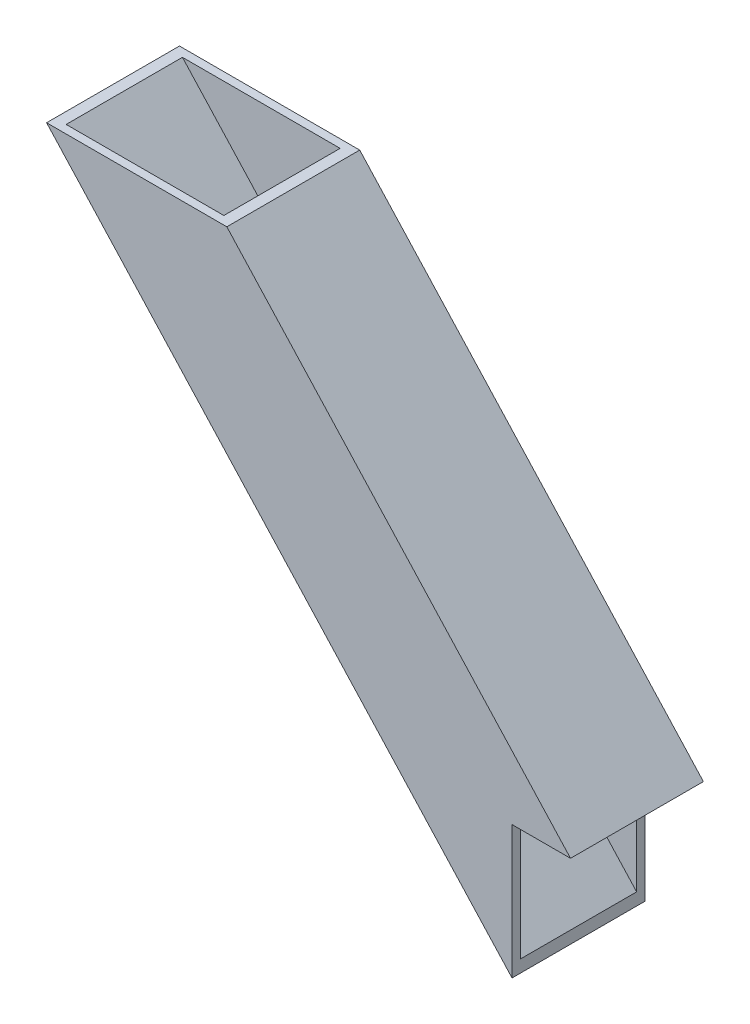
ISO-10303-21;
HEADER;
FILE_DESCRIPTION(('STEP AP214'),'2;1');
FILE_NAME('part.step','',(''),(''),'','','');
FILE_SCHEMA(('AUTOMOTIVE_DESIGN { 1 0 10303 214 1 1 1 1 }'));
ENDSEC;
DATA;
#1=APPLICATION_CONTEXT('core data for automotive mechanical design processes');
#2=APPLICATION_PROTOCOL_DEFINITION('international standard','automotive_design',2000,#1);
#3=PRODUCT_CONTEXT('',#1,'mechanical');
#4=PRODUCT('Part','Part','',(#3));
#5=PRODUCT_RELATED_PRODUCT_CATEGORY('part','',(#4));
#6=PRODUCT_DEFINITION_FORMATION('','',#4);
#7=PRODUCT_DEFINITION_CONTEXT('part definition',#1,'design');
#8=PRODUCT_DEFINITION('design','',#6,#7);
#9=PRODUCT_DEFINITION_SHAPE('','',#8);
#10=(LENGTH_UNIT() NAMED_UNIT(*) SI_UNIT(.MILLI.,.METRE.));
#11=(NAMED_UNIT(*) PLANE_ANGLE_UNIT() SI_UNIT($,.RADIAN.));
#12=(NAMED_UNIT(*) SI_UNIT($,.STERADIAN.) SOLID_ANGLE_UNIT());
#13=UNCERTAINTY_MEASURE_WITH_UNIT(LENGTH_MEASURE(1.E-05),#10,'distance_accuracy_value','');
#14=(GEOMETRIC_REPRESENTATION_CONTEXT(3) GLOBAL_UNCERTAINTY_ASSIGNED_CONTEXT((#13)) GLOBAL_UNIT_ASSIGNED_CONTEXT((#10,
#11,#12)) REPRESENTATION_CONTEXT('',''));
#15=CARTESIAN_POINT('',(0.,0.,0.));
#16=DIRECTION('',(0.,0.,1.));
#17=DIRECTION('',(1.,0.,0.));
#18=AXIS2_PLACEMENT_3D('',#15,#16,#17);
#19=CARTESIAN_POINT('',(-6.32951104794327,-38.9795152991514,50.8));
#20=DIRECTION('',(0.,1.,0.));
#21=DIRECTION('',(0.,0.,1.));
#22=AXIS2_PLACEMENT_3D('',#19,#20,#21);
#23=PLANE('',#22);
#24=DIRECTION('',(1.,0.,0.));
#25=VECTOR('',#24,1.);
#26=CARTESIAN_POINT('',(-6.32951104794328,-38.9795152991514,3.175));
#27=LINE('',#26,#25);
#28=CARTESIAN_POINT('',(-6.32951104794327,-38.9795152991514,3.175));
#29=VERTEX_POINT('',#28);
#30=CARTESIAN_POINT('',(11.7166390082702,-38.9795152991514,3.175));
#31=VERTEX_POINT('',#30);
#32=EDGE_CURVE('E131',#29,#31,#27,.T.);
#33=ORIENTED_EDGE('',*,*,#32,.F.);
#34=DIRECTION('',(0.,0.,-1.));
#35=VECTOR('',#34,1.);
#36=CARTESIAN_POINT('',(-6.32951104794327,-38.9795152991514,50.8));
#37=LINE('',#36,#35);
#38=CARTESIAN_POINT('',(-6.32951104794327,-38.9795152991514,0.));
#39=VERTEX_POINT('',#38);
#40=EDGE_CURVE('E158',#29,#39,#37,.T.);
#41=ORIENTED_EDGE('',*,*,#40,.T.);
#42=DIRECTION('',(1.,0.,0.));
#43=VECTOR('',#42,1.);
#44=CARTESIAN_POINT('',(-6.32951104794327,-38.9795152991514,0.));
#45=LINE('',#44,#43);
#46=CARTESIAN_POINT('',(16.0230239213639,-38.9795152991514,0.));
#47=VERTEX_POINT('',#46);
#48=EDGE_CURVE('E141',#39,#47,#45,.T.);
#49=ORIENTED_EDGE('',*,*,#48,.T.);
#50=DIRECTION('',(0.,0.,-1.));
#51=VECTOR('',#50,1.);
#52=CARTESIAN_POINT('',(16.0230239213639,-38.9795152991514,50.8));
#53=LINE('',#52,#51);
#54=CARTESIAN_POINT('',(16.0230239213639,-38.9795152991514,50.8));
#55=VERTEX_POINT('',#54);
#56=EDGE_CURVE('E177',#55,#47,#53,.T.);
#57=ORIENTED_EDGE('',*,*,#56,.F.);
#58=DIRECTION('',(1.,0.,0.));
#59=VECTOR('',#58,1.);
#60=CARTESIAN_POINT('',(-6.32951104794327,-38.9795152991514,50.8));
#61=LINE('',#60,#59);
#62=CARTESIAN_POINT('',(-6.32951104794327,-38.9795152991514,50.8));
#63=VERTEX_POINT('',#62);
#64=EDGE_CURVE('E144',#63,#55,#61,.T.);
#65=ORIENTED_EDGE('',*,*,#64,.F.);
#66=CARTESIAN_POINT('',(-6.32951104794327,-38.9795152991514,47.625));
#67=VERTEX_POINT('',#66);
#68=EDGE_CURVE('E170',#63,#67,#37,.T.);
#69=ORIENTED_EDGE('',*,*,#68,.T.);
#70=DIRECTION('',(-1.,0.,0.));
#71=VECTOR('',#70,1.);
#72=CARTESIAN_POINT('',(-6.32951104794327,-38.9795152991514,47.625));
#73=LINE('',#72,#71);
#74=CARTESIAN_POINT('',(11.7166390082702,-38.9795152991514,47.625));
#75=VERTEX_POINT('',#74);
#76=EDGE_CURVE('E136',#75,#67,#73,.T.);
#77=ORIENTED_EDGE('',*,*,#76,.F.);
#78=DIRECTION('',(0.,0.,1.));
#79=VECTOR('',#78,1.);
#80=CARTESIAN_POINT('',(11.7166390082702,-38.9795152991514,50.8));
#81=LINE('',#80,#79);
#82=EDGE_CURVE('E142',#31,#75,#81,.T.);
#83=ORIENTED_EDGE('',*,*,#82,.F.);
#84=EDGE_LOOP('',(#33,#41,#49,#57,#65,#69,#77,#83));
#85=FACE_BOUND('',#84,.T.);
#86=ADVANCED_FACE('F39',(#85),#23,.F.);
#87=CARTESIAN_POINT('',(-184.267879600272,104.406138968402,50.8));
#88=DIRECTION('',(0.,-1.,0.));
#89=DIRECTION('',(0.,0.,-1.));
#90=AXIS2_PLACEMENT_3D('',#87,#88,#89);
#91=PLANE('',#90);
#92=DIRECTION('',(-1.,0.,0.));
#93=VECTOR('',#92,1.);
#94=CARTESIAN_POINT('',(-184.267879600272,104.406138968402,0.));
#95=LINE('',#94,#93);
#96=CARTESIAN_POINT('',(-115.36572099088,104.406138968402,0.));
#97=VERTEX_POINT('',#96);
#98=CARTESIAN_POINT('',(-184.267879600272,104.406138968402,0.));
#99=VERTEX_POINT('',#98);
#100=EDGE_CURVE('E163',#97,#99,#95,.T.);
#101=ORIENTED_EDGE('',*,*,#100,.T.);
#102=DIRECTION('',(0.,0.,-1.));
#103=VECTOR('',#102,1.);
#104=CARTESIAN_POINT('',(-184.267879600272,104.406138968402,50.8));
#105=LINE('',#104,#103);
#106=CARTESIAN_POINT('',(-184.267879600272,104.406138968402,50.8));
#107=VERTEX_POINT('',#106);
#108=EDGE_CURVE('E173',#107,#99,#105,.T.);
#109=ORIENTED_EDGE('',*,*,#108,.F.);
#110=DIRECTION('',(-1.,0.,0.));
#111=VECTOR('',#110,1.);
#112=CARTESIAN_POINT('',(-184.267879600272,104.406138968402,50.8));
#113=LINE('',#112,#111);
#114=CARTESIAN_POINT('',(-115.36572099088,104.406138968402,50.8));
#115=VERTEX_POINT('',#114);
#116=EDGE_CURVE('E147',#115,#107,#113,.T.);
#117=ORIENTED_EDGE('',*,*,#116,.F.);
#118=DIRECTION('',(0.,0.,-1.));
#119=VECTOR('',#118,1.);
#120=CARTESIAN_POINT('',(-115.36572099088,104.406138968402,50.8));
#121=LINE('',#120,#119);
#122=EDGE_CURVE('E176',#115,#97,#121,.T.);
#123=ORIENTED_EDGE('',*,*,#122,.T.);
#124=EDGE_LOOP('',(#101,#109,#117,#123));
#125=FACE_BOUND('',#124,.T.);
#126=DIRECTION('',(1.,0.,0.));
#127=VECTOR('',#126,1.);
#128=CARTESIAN_POINT('',(-121.581244765128,104.406138968402,3.175));
#129=LINE('',#128,#127);
#130=CARTESIAN_POINT('',(-179.961494687184,104.406138968402,3.17500000000001));
#131=VERTEX_POINT('',#130);
#132=CARTESIAN_POINT('',(-119.672105903974,104.406138968402,3.175));
#133=VERTEX_POINT('',#132);
#134=EDGE_CURVE('E123',#131,#133,#129,.T.);
#135=ORIENTED_EDGE('',*,*,#134,.T.);
#136=DIRECTION('',(0.,0.,1.));
#137=VECTOR('',#136,1.);
#138=CARTESIAN_POINT('',(-119.672105903974,104.406138968402,3.175));
#139=LINE('',#138,#137);
#140=CARTESIAN_POINT('',(-119.672105903974,104.406138968402,47.625));
#141=VERTEX_POINT('',#140);
#142=EDGE_CURVE('E112',#133,#141,#139,.T.);
#143=ORIENTED_EDGE('',*,*,#142,.T.);
#144=DIRECTION('',(-1.,0.,0.));
#145=VECTOR('',#144,1.);
#146=CARTESIAN_POINT('',(-121.581244765128,104.406138968402,47.625));
#147=LINE('',#146,#145);
#148=CARTESIAN_POINT('',(-179.961494687184,104.406138968402,47.625));
#149=VERTEX_POINT('',#148);
#150=EDGE_CURVE('E121',#141,#149,#147,.T.);
#151=ORIENTED_EDGE('',*,*,#150,.T.);
#152=DIRECTION('',(0.,0.,-1.));
#153=VECTOR('',#152,1.);
#154=CARTESIAN_POINT('',(-179.961494687184,104.406138968402,3.17500000000001));
#155=LINE('',#154,#153);
#156=EDGE_CURVE('E133',#149,#131,#155,.T.);
#157=ORIENTED_EDGE('',*,*,#156,.T.);
#158=EDGE_LOOP('',(#135,#143,#151,#157));
#159=FACE_BOUND('',#158,.T.);
#160=ADVANCED_FACE('F132',(#125,#159),#91,.F.);
#161=CARTESIAN_POINT('',(-6.32951104794326,-89.7795152991514,50.8));
#162=DIRECTION('',(-1.,0.,0.));
#163=DIRECTION('',(0.,-1.,0.));
#164=AXIS2_PLACEMENT_3D('',#161,#162,#163);
#165=PLANE('',#164);
#166=DIRECTION('',(0.,1.,0.));
#167=VECTOR('',#166,1.);
#168=CARTESIAN_POINT('',(-6.32951104794326,-89.7795152991514,3.175));
#169=LINE('',#168,#167);
#170=CARTESIAN_POINT('',(-6.32951104794327,-85.0799208346211,3.17500000000001));
#171=VERTEX_POINT('',#170);
#172=EDGE_CURVE('E11',#171,#29,#169,.T.);
#173=ORIENTED_EDGE('',*,*,#172,.F.);
#174=DIRECTION('',(0.,0.,-1.));
#175=VECTOR('',#174,1.);
#176=CARTESIAN_POINT('',(-6.32951104794326,-85.0799208346211,50.8));
#177=LINE('',#176,#175);
#178=CARTESIAN_POINT('',(-6.32951104794326,-85.0799208346211,47.625));
#179=VERTEX_POINT('',#178);
#180=EDGE_CURVE('E185',#179,#171,#177,.T.);
#181=ORIENTED_EDGE('',*,*,#180,.F.);
#182=DIRECTION('',(0.,-1.,0.));
#183=VECTOR('',#182,1.);
#184=CARTESIAN_POINT('',(-6.32951104794326,-89.7795152991514,47.625));
#185=LINE('',#184,#183);
#186=EDGE_CURVE('E46',#67,#179,#185,.T.);
#187=ORIENTED_EDGE('',*,*,#186,.F.);
#188=ORIENTED_EDGE('',*,*,#68,.F.);
#189=DIRECTION('',(0.,1.,0.));
#190=VECTOR('',#189,1.);
#191=CARTESIAN_POINT('',(-6.32951104794326,-89.7795152991514,50.8));
#192=LINE('',#191,#190);
#193=CARTESIAN_POINT('',(-6.32951104794326,-89.7795152991514,50.8));
#194=VERTEX_POINT('',#193);
#195=EDGE_CURVE('E153',#194,#63,#192,.T.);
#196=ORIENTED_EDGE('',*,*,#195,.F.);
#197=DIRECTION('',(0.,0.,-1.));
#198=VECTOR('',#197,1.);
#199=CARTESIAN_POINT('',(-6.32951104794326,-89.7795152991514,50.8));
#200=LINE('',#199,#198);
#201=CARTESIAN_POINT('',(-6.32951104794326,-89.7795152991514,0.));
#202=VERTEX_POINT('',#201);
#203=EDGE_CURVE('E167',#194,#202,#200,.T.);
#204=ORIENTED_EDGE('',*,*,#203,.T.);
#205=DIRECTION('',(0.,1.,0.));
#206=VECTOR('',#205,1.);
#207=CARTESIAN_POINT('',(-6.32951104794326,-89.7795152991514,0.));
#208=LINE('',#207,#206);
#209=EDGE_CURVE('E146',#202,#39,#208,.T.);
#210=ORIENTED_EDGE('',*,*,#209,.T.);
#211=ORIENTED_EDGE('',*,*,#40,.F.);
#212=EDGE_LOOP('',(#173,#181,#187,#188,#196,#204,#210,#211));
#213=FACE_BOUND('',#212,.T.);
#214=ADVANCED_FACE('F193',(#213),#165,.F.);
#215=CARTESIAN_POINT('',(-115.36572099088,104.406138968402,50.8));
#216=DIRECTION('',(-0.737277336810123,-0.675590207615662,0.));
#217=DIRECTION('',(0.675590207615662,-0.737277336810123,0.));
#218=AXIS2_PLACEMENT_3D('',#215,#216,#217);
#219=PLANE('',#218);
#220=DIRECTION('',(-0.675590207615662,0.737277336810123,0.));
#221=VECTOR('',#220,1.);
#222=CARTESIAN_POINT('',(-115.36572099088,104.406138968402,0.));
#223=LINE('',#222,#221);
#224=EDGE_CURVE('E159',#47,#97,#223,.T.);
#225=ORIENTED_EDGE('',*,*,#224,.T.);
#226=ORIENTED_EDGE('',*,*,#122,.F.);
#227=DIRECTION('',(-0.675590207615662,0.737277336810123,0.));
#228=VECTOR('',#227,1.);
#229=CARTESIAN_POINT('',(-115.36572099088,104.406138968402,50.8));
#230=LINE('',#229,#228);
#231=EDGE_CURVE('E150',#55,#115,#230,.T.);
#232=ORIENTED_EDGE('',*,*,#231,.F.);
#233=ORIENTED_EDGE('',*,*,#56,.T.);
#234=EDGE_LOOP('',(#225,#226,#232,#233));
#235=FACE_BOUND('',#234,.T.);
#236=ADVANCED_FACE('F216',(#235),#219,.F.);
#237=CARTESIAN_POINT('',(-6.32951104794326,-89.7795152991514,50.8));
#238=DIRECTION('',(0.737277336810123,0.675590207615662,0.));
#239=DIRECTION('',(-0.675590207615662,0.737277336810123,0.));
#240=AXIS2_PLACEMENT_3D('',#237,#238,#239);
#241=PLANE('',#240);
#242=DIRECTION('',(0.675590207615662,-0.737277336810123,0.));
#243=VECTOR('',#242,1.);
#244=CARTESIAN_POINT('',(-6.32951104794326,-89.7795152991514,0.));
#245=LINE('',#244,#243);
#246=EDGE_CURVE('E161',#99,#202,#245,.T.);
#247=ORIENTED_EDGE('',*,*,#246,.T.);
#248=ORIENTED_EDGE('',*,*,#203,.F.);
#249=DIRECTION('',(0.675590207615662,-0.737277336810123,0.));
#250=VECTOR('',#249,1.);
#251=CARTESIAN_POINT('',(-6.32951104794326,-89.7795152991514,50.8));
#252=LINE('',#251,#250);
#253=EDGE_CURVE('E155',#107,#194,#252,.T.);
#254=ORIENTED_EDGE('',*,*,#253,.F.);
#255=ORIENTED_EDGE('',*,*,#108,.T.);
#256=EDGE_LOOP('',(#247,#248,#254,#255));
#257=FACE_BOUND('',#256,.T.);
#258=ADVANCED_FACE('F209',(#257),#241,.F.);
#259=CARTESIAN_POINT('',(0.,0.,50.8));
#260=DIRECTION('',(0.,0.,1.));
#261=DIRECTION('',(1.,0.,0.));
#262=AXIS2_PLACEMENT_3D('',#259,#260,#261);
#263=PLANE('',#262);
#264=ORIENTED_EDGE('',*,*,#64,.T.);
#265=ORIENTED_EDGE('',*,*,#231,.T.);
#266=ORIENTED_EDGE('',*,*,#116,.T.);
#267=ORIENTED_EDGE('',*,*,#253,.T.);
#268=ORIENTED_EDGE('',*,*,#195,.T.);
#269=EDGE_LOOP('',(#264,#265,#266,#267,#268));
#270=FACE_BOUND('',#269,.T.);
#271=ADVANCED_FACE('F204',(#270),#263,.T.);
#272=CARTESIAN_POINT('',(0.,0.,0.));
#273=DIRECTION('',(0.,0.,1.));
#274=DIRECTION('',(1.,0.,0.));
#275=AXIS2_PLACEMENT_3D('',#272,#273,#274);
#276=PLANE('',#275);
#277=ORIENTED_EDGE('',*,*,#48,.F.);
#278=ORIENTED_EDGE('',*,*,#209,.F.);
#279=ORIENTED_EDGE('',*,*,#246,.F.);
#280=ORIENTED_EDGE('',*,*,#100,.F.);
#281=ORIENTED_EDGE('',*,*,#224,.F.);
#282=EDGE_LOOP('',(#277,#278,#279,#280,#281));
#283=FACE_BOUND('',#282,.T.);
#284=ADVANCED_FACE('F214',(#283),#276,.F.);
#285=CARTESIAN_POINT('',(-121.581244765128,106.489598437301,3.175));
#286=DIRECTION('',(-0.737277336810123,-0.675590207615662,0.));
#287=DIRECTION('',(0.675590207615662,-0.737277336810123,0.));
#288=AXIS2_PLACEMENT_3D('',#285,#286,#287);
#289=PLANE('',#288);
#290=ORIENTED_EDGE('',*,*,#82,.T.);
#291=DIRECTION('',(0.675590207615662,-0.737277336810123,0.));
#292=VECTOR('',#291,1.);
#293=CARTESIAN_POINT('',(-121.581244765128,106.489598437301,47.625));
#294=LINE('',#293,#292);
#295=EDGE_CURVE('E119',#141,#75,#294,.T.);
#296=ORIENTED_EDGE('',*,*,#295,.F.);
#297=ORIENTED_EDGE('',*,*,#142,.F.);
#298=DIRECTION('',(0.675590207615662,-0.737277336810123,0.));
#299=VECTOR('',#298,1.);
#300=CARTESIAN_POINT('',(-121.581244765128,106.489598437301,3.175));
#301=LINE('',#300,#299);
#302=EDGE_CURVE('E120',#133,#31,#301,.T.);
#303=ORIENTED_EDGE('',*,*,#302,.T.);
#304=EDGE_LOOP('',(#290,#296,#297,#303));
#305=FACE_BOUND('',#304,.T.);
#306=ADVANCED_FACE('F116',(#305),#289,.T.);
#307=CARTESIAN_POINT('',(-121.581244765128,106.489598437301,3.175));
#308=DIRECTION('',(0.,0.,1.));
#309=DIRECTION('',(1.,0.,0.));
#310=AXIS2_PLACEMENT_3D('',#307,#308,#309);
#311=PLANE('',#310);
#312=ORIENTED_EDGE('',*,*,#32,.T.);
#313=ORIENTED_EDGE('',*,*,#302,.F.);
#314=ORIENTED_EDGE('',*,*,#134,.F.);
#315=DIRECTION('',(0.675590207615662,-0.737277336810123,0.));
#316=VECTOR('',#315,1.);
#317=CARTESIAN_POINT('',(-181.870633548338,106.489598437301,3.17500000000001));
#318=LINE('',#317,#316);
#319=EDGE_CURVE('E52',#131,#171,#318,.T.);
#320=ORIENTED_EDGE('',*,*,#319,.T.);
#321=ORIENTED_EDGE('',*,*,#172,.T.);
#322=EDGE_LOOP('',(#312,#313,#314,#320,#321));
#323=FACE_BOUND('',#322,.T.);
#324=ADVANCED_FACE('F126',(#323),#311,.T.);
#325=CARTESIAN_POINT('',(-121.581244765128,106.489598437301,47.625));
#326=DIRECTION('',(0.,0.,-1.));
#327=DIRECTION('',(-1.,0.,0.));
#328=AXIS2_PLACEMENT_3D('',#325,#326,#327);
#329=PLANE('',#328);
#330=ORIENTED_EDGE('',*,*,#76,.T.);
#331=ORIENTED_EDGE('',*,*,#186,.T.);
#332=DIRECTION('',(0.675590207615662,-0.737277336810123,0.));
#333=VECTOR('',#332,1.);
#334=CARTESIAN_POINT('',(-181.870633548338,106.489598437301,47.625));
#335=LINE('',#334,#333);
#336=EDGE_CURVE('E59',#149,#179,#335,.T.);
#337=ORIENTED_EDGE('',*,*,#336,.F.);
#338=ORIENTED_EDGE('',*,*,#150,.F.);
#339=ORIENTED_EDGE('',*,*,#295,.T.);
#340=EDGE_LOOP('',(#330,#331,#337,#338,#339));
#341=FACE_BOUND('',#340,.T.);
#342=ADVANCED_FACE('F187',(#341),#329,.T.);
#343=CARTESIAN_POINT('',(-181.870633548338,106.489598437301,3.17500000000001));
#344=DIRECTION('',(0.737277336810123,0.675590207615662,0.));
#345=DIRECTION('',(-0.675590207615662,0.737277336810123,0.));
#346=AXIS2_PLACEMENT_3D('',#343,#344,#345);
#347=PLANE('',#346);
#348=ORIENTED_EDGE('',*,*,#180,.T.);
#349=ORIENTED_EDGE('',*,*,#319,.F.);
#350=ORIENTED_EDGE('',*,*,#156,.F.);
#351=ORIENTED_EDGE('',*,*,#336,.T.);
#352=EDGE_LOOP('',(#348,#349,#350,#351));
#353=FACE_BOUND('',#352,.T.);
#354=ADVANCED_FACE('F191',(#353),#347,.T.);
#355=CLOSED_SHELL('',(#86,#160,#214,#236,#258,#271,#284,#306,#324,#342,#354));
#356=MANIFOLD_SOLID_BREP('B2',#355);
#357=ADVANCED_BREP_SHAPE_REPRESENTATION('',(#18,#356),#14);
#358=SHAPE_DEFINITION_REPRESENTATION(#9,#357);
ENDSEC;
END-ISO-10303-21;
